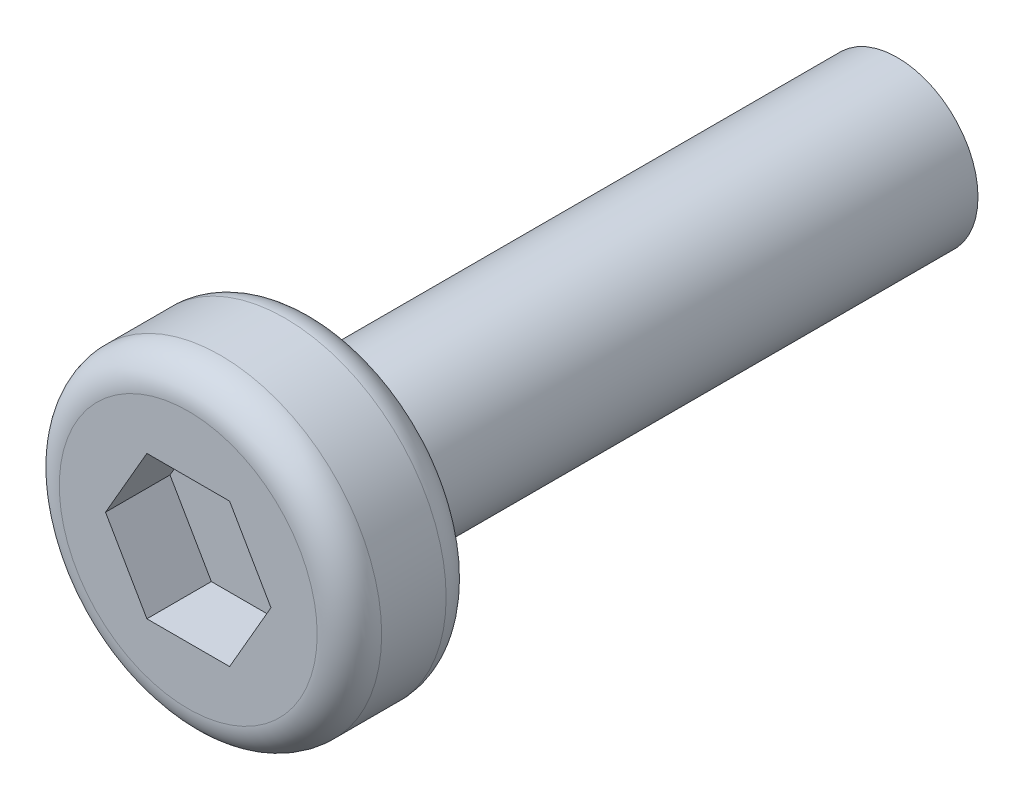
ISO-10303-21;
HEADER;
FILE_DESCRIPTION(('STEP AP214'),'2;1');
FILE_NAME('part.step','',(''),(''),'','','');
FILE_SCHEMA(('AUTOMOTIVE_DESIGN { 1 0 10303 214 1 1 1 1 }'));
ENDSEC;
DATA;
#1=APPLICATION_CONTEXT('core data for automotive mechanical design processes');
#2=APPLICATION_PROTOCOL_DEFINITION('international standard','automotive_design',2000,#1);
#3=PRODUCT_CONTEXT('',#1,'mechanical');
#4=PRODUCT('Part','Part','',(#3));
#5=PRODUCT_RELATED_PRODUCT_CATEGORY('part','',(#4));
#6=PRODUCT_DEFINITION_FORMATION('','',#4);
#7=PRODUCT_DEFINITION_CONTEXT('part definition',#1,'design');
#8=PRODUCT_DEFINITION('design','',#6,#7);
#9=PRODUCT_DEFINITION_SHAPE('','',#8);
#10=(LENGTH_UNIT() NAMED_UNIT(*) SI_UNIT(.MILLI.,.METRE.));
#11=(NAMED_UNIT(*) PLANE_ANGLE_UNIT() SI_UNIT($,.RADIAN.));
#12=(NAMED_UNIT(*) SI_UNIT($,.STERADIAN.) SOLID_ANGLE_UNIT());
#13=UNCERTAINTY_MEASURE_WITH_UNIT(LENGTH_MEASURE(1.E-05),#10,'distance_accuracy_value','');
#14=(GEOMETRIC_REPRESENTATION_CONTEXT(3) GLOBAL_UNCERTAINTY_ASSIGNED_CONTEXT((#13)) GLOBAL_UNIT_ASSIGNED_CONTEXT((#10,
#11,#12)) REPRESENTATION_CONTEXT('',''));
#15=CARTESIAN_POINT('',(0.,0.,0.));
#16=DIRECTION('',(0.,0.,1.));
#17=DIRECTION('',(1.,0.,0.));
#18=AXIS2_PLACEMENT_3D('',#15,#16,#17);
#19=CARTESIAN_POINT('',(0.,0.,-9.));
#20=DIRECTION('',(0.,0.,1.));
#21=DIRECTION('',(1.,0.,0.));
#22=AXIS2_PLACEMENT_3D('',#19,#20,#21);
#23=CYLINDRICAL_SURFACE('',#22,1.25);
#24=CARTESIAN_POINT('',(0.,0.,-9.));
#25=DIRECTION('',(0.,0.,1.));
#26=DIRECTION('',(1.,0.,0.));
#27=AXIS2_PLACEMENT_3D('',#24,#25,#26);
#28=CIRCLE('',#27,1.25);
#29=CARTESIAN_POINT('',(1.25,0.,-9.));
#30=VERTEX_POINT('',#29);
#31=EDGE_CURVE('E166',#30,#30,#28,.T.);
#32=ORIENTED_EDGE('',*,*,#31,.T.);
#33=EDGE_LOOP('',(#32));
#34=FACE_BOUND('',#33,.T.);
#35=CARTESIAN_POINT('',(0.,0.,0.));
#36=DIRECTION('',(0.,0.,1.));
#37=DIRECTION('',(1.,0.,0.));
#38=AXIS2_PLACEMENT_3D('',#35,#36,#37);
#39=CIRCLE('',#38,1.25);
#40=CARTESIAN_POINT('',(1.25,0.,0.));
#41=VERTEX_POINT('',#40);
#42=EDGE_CURVE('E156',#41,#41,#39,.T.);
#43=ORIENTED_EDGE('',*,*,#42,.F.);
#44=EDGE_LOOP('',(#43));
#45=FACE_BOUND('',#44,.T.);
#46=ADVANCED_FACE('F41',(#34,#45),#23,.T.);
#47=CARTESIAN_POINT('',(0.,0.,-9.));
#48=DIRECTION('',(0.,0.,1.));
#49=DIRECTION('',(1.,0.,0.));
#50=AXIS2_PLACEMENT_3D('',#47,#48,#49);
#51=PLANE('',#50);
#52=ORIENTED_EDGE('',*,*,#31,.F.);
#53=EDGE_LOOP('',(#52));
#54=FACE_BOUND('',#53,.T.);
#55=ADVANCED_FACE('F196',(#54),#51,.F.);
#56=CARTESIAN_POINT('',(0.,0.,2.));
#57=DIRECTION('',(0.,0.,-1.));
#58=DIRECTION('',(-1.,0.,0.));
#59=AXIS2_PLACEMENT_3D('',#56,#57,#58);
#60=CYLINDRICAL_SURFACE('',#59,2.5);
#61=CARTESIAN_POINT('',(0.,0.,0.5));
#62=DIRECTION('',(0.,0.,1.));
#63=DIRECTION('',(1.,0.,0.));
#64=AXIS2_PLACEMENT_3D('',#61,#62,#63);
#65=CIRCLE('',#64,2.5);
#66=CARTESIAN_POINT('',(2.5,0.,0.5));
#67=VERTEX_POINT('',#66);
#68=EDGE_CURVE('E177',#67,#67,#65,.T.);
#69=ORIENTED_EDGE('',*,*,#68,.T.);
#70=EDGE_LOOP('',(#69));
#71=FACE_BOUND('',#70,.T.);
#72=CARTESIAN_POINT('',(0.,0.,1.5));
#73=DIRECTION('',(0.,0.,1.));
#74=DIRECTION('',(1.,0.,0.));
#75=AXIS2_PLACEMENT_3D('',#72,#73,#74);
#76=CIRCLE('',#75,2.5);
#77=CARTESIAN_POINT('',(2.5,0.,1.5));
#78=VERTEX_POINT('',#77);
#79=EDGE_CURVE('E170',#78,#78,#76,.F.);
#80=ORIENTED_EDGE('',*,*,#79,.T.);
#81=EDGE_LOOP('',(#80));
#82=FACE_BOUND('',#81,.T.);
#83=ADVANCED_FACE('F192',(#71,#82),#60,.T.);
#84=CARTESIAN_POINT('',(0.,0.,2.));
#85=DIRECTION('',(0.,0.,1.));
#86=DIRECTION('',(1.,0.,0.));
#87=AXIS2_PLACEMENT_3D('',#84,#85,#86);
#88=PLANE('',#87);
#89=CARTESIAN_POINT('',(0.,0.,2.));
#90=DIRECTION('',(0.,0.,1.));
#91=DIRECTION('',(1.,0.,0.));
#92=AXIS2_PLACEMENT_3D('',#89,#90,#91);
#93=CIRCLE('',#92,2.);
#94=CARTESIAN_POINT('',(2.,0.,2.));
#95=VERTEX_POINT('',#94);
#96=EDGE_CURVE('E11',#95,#95,#93,.T.);
#97=ORIENTED_EDGE('',*,*,#96,.T.);
#98=EDGE_LOOP('',(#97));
#99=FACE_BOUND('',#98,.T.);
#100=DIRECTION('',(0.499999999999995,0.866025403784442,0.));
#101=VECTOR('',#100,1.);
#102=CARTESIAN_POINT('',(0.641501252387394,-1.111112762254,2.));
#103=LINE('',#102,#101);
#104=CARTESIAN_POINT('',(0.641501252387394,-1.111112762254,2.));
#105=VERTEX_POINT('',#104);
#106=CARTESIAN_POINT('',(1.28300250477476,0.,2.));
#107=VERTEX_POINT('',#106);
#108=EDGE_CURVE('E57',#105,#107,#103,.T.);
#109=ORIENTED_EDGE('',*,*,#108,.F.);
#110=DIRECTION('',(1.,0.,0.));
#111=VECTOR('',#110,1.);
#112=CARTESIAN_POINT('',(-0.64150125238737,-1.11111276225401,2.));
#113=LINE('',#112,#111);
#114=CARTESIAN_POINT('',(-0.64150125238737,-1.11111276225401,2.));
#115=VERTEX_POINT('',#114);
#116=EDGE_CURVE('E150',#115,#105,#113,.T.);
#117=ORIENTED_EDGE('',*,*,#116,.F.);
#118=DIRECTION('',(0.500000000000007,-0.866025403784435,0.));
#119=VECTOR('',#118,1.);
#120=CARTESIAN_POINT('',(-1.28300250477476,0.,2.));
#121=LINE('',#120,#119);
#122=CARTESIAN_POINT('',(-1.28300250477476,0.,2.));
#123=VERTEX_POINT('',#122);
#124=EDGE_CURVE('E147',#123,#115,#121,.T.);
#125=ORIENTED_EDGE('',*,*,#124,.F.);
#126=DIRECTION('',(-0.499999999999995,-0.866025403784442,0.));
#127=VECTOR('',#126,1.);
#128=CARTESIAN_POINT('',(-0.641501252387386,1.11111276225401,2.));
#129=LINE('',#128,#127);
#130=CARTESIAN_POINT('',(-0.641501252387386,1.11111276225401,2.));
#131=VERTEX_POINT('',#130);
#132=EDGE_CURVE('E105',#131,#123,#129,.T.);
#133=ORIENTED_EDGE('',*,*,#132,.F.);
#134=DIRECTION('',(-1.,0.,0.));
#135=VECTOR('',#134,1.);
#136=CARTESIAN_POINT('',(0.641501252387378,1.11111276225401,2.));
#137=LINE('',#136,#135);
#138=CARTESIAN_POINT('',(0.641501252387378,1.11111276225401,2.));
#139=VERTEX_POINT('',#138);
#140=EDGE_CURVE('E141',#139,#131,#137,.T.);
#141=ORIENTED_EDGE('',*,*,#140,.F.);
#142=DIRECTION('',(-0.500000000000001,0.866025403784438,0.));
#143=VECTOR('',#142,1.);
#144=CARTESIAN_POINT('',(1.28300250477476,0.,2.));
#145=LINE('',#144,#143);
#146=EDGE_CURVE('E137',#107,#139,#145,.T.);
#147=ORIENTED_EDGE('',*,*,#146,.F.);
#148=EDGE_LOOP('',(#109,#117,#125,#133,#141,#147));
#149=FACE_BOUND('',#148,.T.);
#150=ADVANCED_FACE('F195',(#99,#149),#88,.T.);
#151=CARTESIAN_POINT('',(0.,0.,0.));
#152=DIRECTION('',(0.,0.,1.));
#153=DIRECTION('',(1.,0.,0.));
#154=AXIS2_PLACEMENT_3D('',#151,#152,#153);
#155=PLANE('',#154);
#156=CARTESIAN_POINT('',(0.,0.,0.));
#157=DIRECTION('',(0.,0.,1.));
#158=DIRECTION('',(1.,0.,0.));
#159=AXIS2_PLACEMENT_3D('',#156,#157,#158);
#160=CIRCLE('',#159,2.);
#161=CARTESIAN_POINT('',(2.,0.,0.));
#162=VERTEX_POINT('',#161);
#163=EDGE_CURVE('E50',#162,#162,#160,.F.);
#164=ORIENTED_EDGE('',*,*,#163,.T.);
#165=EDGE_LOOP('',(#164));
#166=FACE_BOUND('',#165,.T.);
#167=ORIENTED_EDGE('',*,*,#42,.T.);
#168=EDGE_LOOP('',(#167));
#169=FACE_BOUND('',#168,.T.);
#170=ADVANCED_FACE('F184',(#166,#169),#155,.F.);
#171=CARTESIAN_POINT('',(0.641501252387394,-1.111112762254,1.));
#172=DIRECTION('',(0.866025403784442,-0.499999999999995,0.));
#173=DIRECTION('',(0.499999999999995,0.866025403784442,0.));
#174=AXIS2_PLACEMENT_3D('',#171,#172,#173);
#175=PLANE('',#174);
#176=ORIENTED_EDGE('',*,*,#108,.T.);
#177=DIRECTION('',(0.,0.,1.));
#178=VECTOR('',#177,1.);
#179=CARTESIAN_POINT('',(1.28300250477476,0.,1.));
#180=LINE('',#179,#178);
#181=CARTESIAN_POINT('',(1.28300250477476,0.,1.));
#182=VERTEX_POINT('',#181);
#183=EDGE_CURVE('E87',#182,#107,#180,.T.);
#184=ORIENTED_EDGE('',*,*,#183,.F.);
#185=DIRECTION('',(0.499999999999995,0.866025403784442,0.));
#186=VECTOR('',#185,1.);
#187=CARTESIAN_POINT('',(0.641501252387394,-1.111112762254,1.));
#188=LINE('',#187,#186);
#189=CARTESIAN_POINT('',(0.641501252387394,-1.111112762254,1.));
#190=VERTEX_POINT('',#189);
#191=EDGE_CURVE('E153',#190,#182,#188,.T.);
#192=ORIENTED_EDGE('',*,*,#191,.F.);
#193=DIRECTION('',(0.,0.,1.));
#194=VECTOR('',#193,1.);
#195=CARTESIAN_POINT('',(0.641501252387394,-1.111112762254,1.));
#196=LINE('',#195,#194);
#197=EDGE_CURVE('E65',#190,#105,#196,.T.);
#198=ORIENTED_EDGE('',*,*,#197,.T.);
#199=EDGE_LOOP('',(#176,#184,#192,#198));
#200=FACE_BOUND('',#199,.T.);
#201=ADVANCED_FACE('F215',(#200),#175,.F.);
#202=CARTESIAN_POINT('',(-0.64150125238737,-1.11111276225401,1.));
#203=DIRECTION('',(0.,-1.,0.));
#204=DIRECTION('',(1.,0.,0.));
#205=AXIS2_PLACEMENT_3D('',#202,#203,#204);
#206=PLANE('',#205);
#207=ORIENTED_EDGE('',*,*,#116,.T.);
#208=ORIENTED_EDGE('',*,*,#197,.F.);
#209=DIRECTION('',(1.,0.,0.));
#210=VECTOR('',#209,1.);
#211=CARTESIAN_POINT('',(-0.64150125238737,-1.11111276225401,1.));
#212=LINE('',#211,#210);
#213=CARTESIAN_POINT('',(-0.64150125238737,-1.11111276225401,1.));
#214=VERTEX_POINT('',#213);
#215=EDGE_CURVE('E119',#214,#190,#212,.T.);
#216=ORIENTED_EDGE('',*,*,#215,.F.);
#217=DIRECTION('',(0.,0.,1.));
#218=VECTOR('',#217,1.);
#219=CARTESIAN_POINT('',(-0.64150125238737,-1.11111276225401,1.));
#220=LINE('',#219,#218);
#221=EDGE_CURVE('E110',#214,#115,#220,.T.);
#222=ORIENTED_EDGE('',*,*,#221,.T.);
#223=EDGE_LOOP('',(#207,#208,#216,#222));
#224=FACE_BOUND('',#223,.T.);
#225=ADVANCED_FACE('F217',(#224),#206,.F.);
#226=CARTESIAN_POINT('',(-1.28300250477476,0.,1.));
#227=DIRECTION('',(-0.866025403784435,-0.500000000000007,0.));
#228=DIRECTION('',(0.500000000000007,-0.866025403784435,0.));
#229=AXIS2_PLACEMENT_3D('',#226,#227,#228);
#230=PLANE('',#229);
#231=ORIENTED_EDGE('',*,*,#124,.T.);
#232=ORIENTED_EDGE('',*,*,#221,.F.);
#233=DIRECTION('',(0.500000000000007,-0.866025403784435,0.));
#234=VECTOR('',#233,1.);
#235=CARTESIAN_POINT('',(-1.28300250477476,0.,1.));
#236=LINE('',#235,#234);
#237=CARTESIAN_POINT('',(-1.28300250477476,0.,1.));
#238=VERTEX_POINT('',#237);
#239=EDGE_CURVE('E114',#238,#214,#236,.T.);
#240=ORIENTED_EDGE('',*,*,#239,.F.);
#241=DIRECTION('',(0.,0.,1.));
#242=VECTOR('',#241,1.);
#243=CARTESIAN_POINT('',(-1.28300250477476,0.,1.));
#244=LINE('',#243,#242);
#245=EDGE_CURVE('E98',#238,#123,#244,.T.);
#246=ORIENTED_EDGE('',*,*,#245,.T.);
#247=EDGE_LOOP('',(#231,#232,#240,#246));
#248=FACE_BOUND('',#247,.T.);
#249=ADVANCED_FACE('F115',(#248),#230,.F.);
#250=CARTESIAN_POINT('',(-0.641501252387386,1.11111276225401,1.));
#251=DIRECTION('',(-0.866025403784442,0.499999999999995,0.));
#252=DIRECTION('',(-0.499999999999995,-0.866025403784442,0.));
#253=AXIS2_PLACEMENT_3D('',#250,#251,#252);
#254=PLANE('',#253);
#255=ORIENTED_EDGE('',*,*,#132,.T.);
#256=ORIENTED_EDGE('',*,*,#245,.F.);
#257=DIRECTION('',(-0.499999999999995,-0.866025403784442,0.));
#258=VECTOR('',#257,1.);
#259=CARTESIAN_POINT('',(-0.641501252387386,1.11111276225401,1.));
#260=LINE('',#259,#258);
#261=CARTESIAN_POINT('',(-0.641501252387386,1.11111276225401,1.));
#262=VERTEX_POINT('',#261);
#263=EDGE_CURVE('E102',#262,#238,#260,.T.);
#264=ORIENTED_EDGE('',*,*,#263,.F.);
#265=DIRECTION('',(0.,0.,1.));
#266=VECTOR('',#265,1.);
#267=CARTESIAN_POINT('',(-0.641501252387386,1.11111276225401,1.));
#268=LINE('',#267,#266);
#269=EDGE_CURVE('E111',#262,#131,#268,.T.);
#270=ORIENTED_EDGE('',*,*,#269,.T.);
#271=EDGE_LOOP('',(#255,#256,#264,#270));
#272=FACE_BOUND('',#271,.T.);
#273=ADVANCED_FACE('F100',(#272),#254,.F.);
#274=CARTESIAN_POINT('',(0.641501252387378,1.11111276225401,1.));
#275=DIRECTION('',(0.,1.,0.));
#276=DIRECTION('',(-1.,0.,0.));
#277=AXIS2_PLACEMENT_3D('',#274,#275,#276);
#278=PLANE('',#277);
#279=ORIENTED_EDGE('',*,*,#140,.T.);
#280=ORIENTED_EDGE('',*,*,#269,.F.);
#281=DIRECTION('',(-1.,0.,0.));
#282=VECTOR('',#281,1.);
#283=CARTESIAN_POINT('',(0.641501252387378,1.11111276225401,1.));
#284=LINE('',#283,#282);
#285=CARTESIAN_POINT('',(0.641501252387378,1.11111276225401,1.));
#286=VERTEX_POINT('',#285);
#287=EDGE_CURVE('E125',#286,#262,#284,.T.);
#288=ORIENTED_EDGE('',*,*,#287,.F.);
#289=DIRECTION('',(0.,0.,1.));
#290=VECTOR('',#289,1.);
#291=CARTESIAN_POINT('',(0.641501252387378,1.11111276225401,1.));
#292=LINE('',#291,#290);
#293=EDGE_CURVE('E161',#286,#139,#292,.T.);
#294=ORIENTED_EDGE('',*,*,#293,.T.);
#295=EDGE_LOOP('',(#279,#280,#288,#294));
#296=FACE_BOUND('',#295,.T.);
#297=ADVANCED_FACE('F278',(#296),#278,.F.);
#298=CARTESIAN_POINT('',(1.28300250477476,0.,1.));
#299=DIRECTION('',(0.866025403784438,0.500000000000001,0.));
#300=DIRECTION('',(-0.500000000000001,0.866025403784438,0.));
#301=AXIS2_PLACEMENT_3D('',#298,#299,#300);
#302=PLANE('',#301);
#303=ORIENTED_EDGE('',*,*,#146,.T.);
#304=ORIENTED_EDGE('',*,*,#293,.F.);
#305=DIRECTION('',(-0.500000000000001,0.866025403784438,0.));
#306=VECTOR('',#305,1.);
#307=CARTESIAN_POINT('',(1.28300250477476,0.,1.));
#308=LINE('',#307,#306);
#309=EDGE_CURVE('E129',#182,#286,#308,.T.);
#310=ORIENTED_EDGE('',*,*,#309,.F.);
#311=ORIENTED_EDGE('',*,*,#183,.T.);
#312=EDGE_LOOP('',(#303,#304,#310,#311));
#313=FACE_BOUND('',#312,.T.);
#314=ADVANCED_FACE('F211',(#313),#302,.F.);
#315=CARTESIAN_POINT('',(0.,0.,1.));
#316=DIRECTION('',(0.,0.,1.));
#317=DIRECTION('',(1.,0.,0.));
#318=AXIS2_PLACEMENT_3D('',#315,#316,#317);
#319=PLANE('',#318);
#320=ORIENTED_EDGE('',*,*,#191,.T.);
#321=ORIENTED_EDGE('',*,*,#309,.T.);
#322=ORIENTED_EDGE('',*,*,#287,.T.);
#323=ORIENTED_EDGE('',*,*,#263,.T.);
#324=ORIENTED_EDGE('',*,*,#239,.T.);
#325=ORIENTED_EDGE('',*,*,#215,.T.);
#326=EDGE_LOOP('',(#320,#321,#322,#323,#324,#325));
#327=FACE_BOUND('',#326,.T.);
#328=ADVANCED_FACE('F122',(#327),#319,.T.);
#329=CARTESIAN_POINT('',(0.,0.,0.5));
#330=DIRECTION('',(0.,0.,1.));
#331=DIRECTION('',(1.,0.,0.));
#332=AXIS2_PLACEMENT_3D('',#329,#330,#331);
#333=TOROIDAL_SURFACE('',#332,2.,0.5);
#334=ORIENTED_EDGE('',*,*,#163,.F.);
#335=EDGE_LOOP('',(#334));
#336=FACE_BOUND('',#335,.T.);
#337=ORIENTED_EDGE('',*,*,#68,.F.);
#338=EDGE_LOOP('',(#337));
#339=FACE_BOUND('',#338,.T.);
#340=ADVANCED_FACE('F187',(#336,#339),#333,.T.);
#341=CARTESIAN_POINT('',(0.,0.,1.5));
#342=DIRECTION('',(0.,0.,1.));
#343=DIRECTION('',(1.,0.,0.));
#344=AXIS2_PLACEMENT_3D('',#341,#342,#343);
#345=TOROIDAL_SURFACE('',#344,2.,0.5);
#346=ORIENTED_EDGE('',*,*,#79,.F.);
#347=EDGE_LOOP('',(#346));
#348=FACE_BOUND('',#347,.T.);
#349=ORIENTED_EDGE('',*,*,#96,.F.);
#350=EDGE_LOOP('',(#349));
#351=FACE_BOUND('',#350,.T.);
#352=ADVANCED_FACE('F43',(#348,#351),#345,.T.);
#353=CLOSED_SHELL('',(#46,#55,#83,#150,#170,#201,#225,#249,#273,#297,#314,#328,#340,#352));
#354=MANIFOLD_SOLID_BREP('B2',#353);
#355=ADVANCED_BREP_SHAPE_REPRESENTATION('',(#18,#354),#14);
#356=SHAPE_DEFINITION_REPRESENTATION(#9,#355);
ENDSEC;
END-ISO-10303-21;
